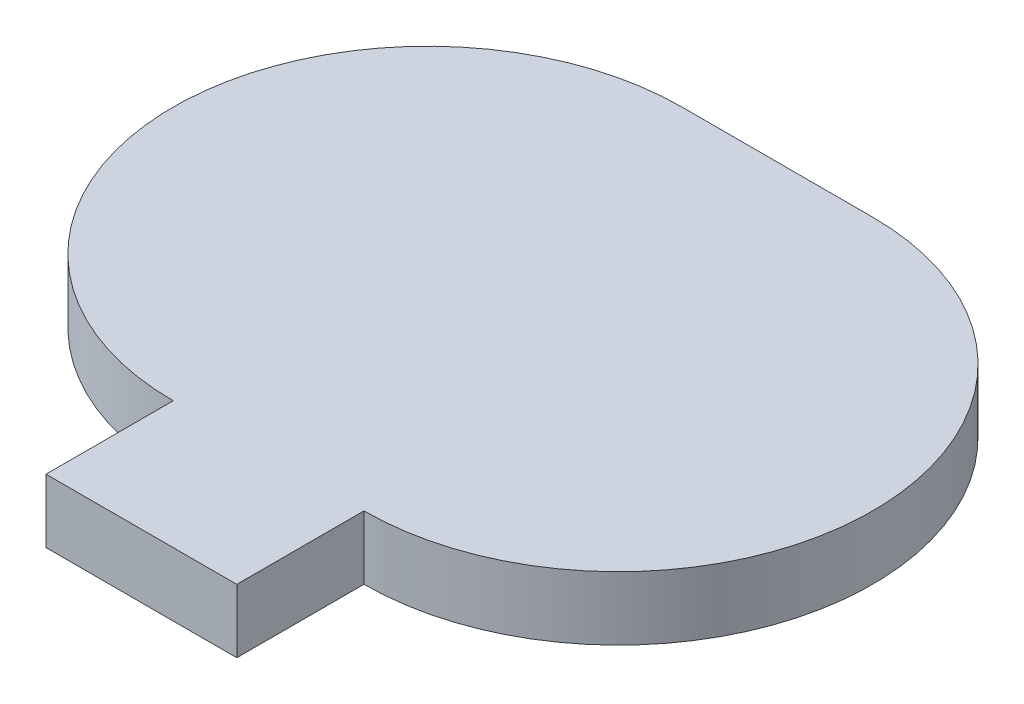
ISO-10303-21;
HEADER;
FILE_DESCRIPTION(('STEP AP214'),'2;1');
FILE_NAME('part.step','',(''),(''),'','','');
FILE_SCHEMA(('AUTOMOTIVE_DESIGN { 1 0 10303 214 1 1 1 1 }'));
ENDSEC;
DATA;
#1=APPLICATION_CONTEXT('core data for automotive mechanical design processes');
#2=APPLICATION_PROTOCOL_DEFINITION('international standard','automotive_design',2000,#1);
#3=PRODUCT_CONTEXT('',#1,'mechanical');
#4=PRODUCT('Part','Part','',(#3));
#5=PRODUCT_RELATED_PRODUCT_CATEGORY('part','',(#4));
#6=PRODUCT_DEFINITION_FORMATION('','',#4);
#7=PRODUCT_DEFINITION_CONTEXT('part definition',#1,'design');
#8=PRODUCT_DEFINITION('design','',#6,#7);
#9=PRODUCT_DEFINITION_SHAPE('','',#8);
#10=(LENGTH_UNIT() NAMED_UNIT(*) SI_UNIT(.MILLI.,.METRE.));
#11=(NAMED_UNIT(*) PLANE_ANGLE_UNIT() SI_UNIT($,.RADIAN.));
#12=(NAMED_UNIT(*) SI_UNIT($,.STERADIAN.) SOLID_ANGLE_UNIT());
#13=UNCERTAINTY_MEASURE_WITH_UNIT(LENGTH_MEASURE(1.E-05),#10,'distance_accuracy_value','');
#14=(GEOMETRIC_REPRESENTATION_CONTEXT(3) GLOBAL_UNCERTAINTY_ASSIGNED_CONTEXT((#13)) GLOBAL_UNIT_ASSIGNED_CONTEXT((#10,
#11,#12)) REPRESENTATION_CONTEXT('',''));
#15=CARTESIAN_POINT('',(0.,0.,0.));
#16=DIRECTION('',(0.,0.,1.));
#17=DIRECTION('',(1.,0.,0.));
#18=AXIS2_PLACEMENT_3D('',#15,#16,#17);
#19=CARTESIAN_POINT('',(-3.,2.,0.));
#20=DIRECTION('',(0.,0.,-1.));
#21=DIRECTION('',(-1.,0.,0.));
#22=AXIS2_PLACEMENT_3D('',#19,#20,#21);
#23=PLANE('',#22);
#24=DIRECTION('',(1.,0.,0.));
#25=VECTOR('',#24,1.);
#26=CARTESIAN_POINT('',(-3.,0.,0.));
#27=LINE('',#26,#25);
#28=CARTESIAN_POINT('',(-3.,0.,0.));
#29=VERTEX_POINT('',#28);
#30=CARTESIAN_POINT('',(3.,0.,0.));
#31=VERTEX_POINT('',#30);
#32=EDGE_CURVE('E117',#29,#31,#27,.T.);
#33=ORIENTED_EDGE('',*,*,#32,.T.);
#34=DIRECTION('',(0.,-1.,0.));
#35=VECTOR('',#34,1.);
#36=CARTESIAN_POINT('',(3.,2.,0.));
#37=LINE('',#36,#35);
#38=CARTESIAN_POINT('',(3.,2.,0.));
#39=VERTEX_POINT('',#38);
#40=EDGE_CURVE('E11',#39,#31,#37,.T.);
#41=ORIENTED_EDGE('',*,*,#40,.F.);
#42=DIRECTION('',(1.,0.,0.));
#43=VECTOR('',#42,1.);
#44=CARTESIAN_POINT('',(-3.,2.,0.));
#45=LINE('',#44,#43);
#46=CARTESIAN_POINT('',(-3.,2.,0.));
#47=VERTEX_POINT('',#46);
#48=EDGE_CURVE('E127',#47,#39,#45,.T.);
#49=ORIENTED_EDGE('',*,*,#48,.F.);
#50=DIRECTION('',(0.,-1.,0.));
#51=VECTOR('',#50,1.);
#52=CARTESIAN_POINT('',(-3.,2.,0.));
#53=LINE('',#52,#51);
#54=EDGE_CURVE('E113',#47,#29,#53,.T.);
#55=ORIENTED_EDGE('',*,*,#54,.T.);
#56=EDGE_LOOP('',(#33,#41,#49,#55));
#57=FACE_BOUND('',#56,.T.);
#58=ADVANCED_FACE('F33',(#57),#23,.F.);
#59=CARTESIAN_POINT('',(3.,2.,0.));
#60=DIRECTION('',(-1.,0.,0.));
#61=DIRECTION('',(0.,0.,1.));
#62=AXIS2_PLACEMENT_3D('',#59,#60,#61);
#63=PLANE('',#62);
#64=DIRECTION('',(0.,0.,-1.));
#65=VECTOR('',#64,1.);
#66=CARTESIAN_POINT('',(3.,0.,0.));
#67=LINE('',#66,#65);
#68=CARTESIAN_POINT('',(3.,0.,-4.));
#69=VERTEX_POINT('',#68);
#70=EDGE_CURVE('E120',#31,#69,#67,.T.);
#71=ORIENTED_EDGE('',*,*,#70,.T.);
#72=DIRECTION('',(0.,-1.,0.));
#73=VECTOR('',#72,1.);
#74=CARTESIAN_POINT('',(3.,2.,-4.));
#75=LINE('',#74,#73);
#76=CARTESIAN_POINT('',(3.,2.,-4.));
#77=VERTEX_POINT('',#76);
#78=EDGE_CURVE('E41',#77,#69,#75,.T.);
#79=ORIENTED_EDGE('',*,*,#78,.F.);
#80=DIRECTION('',(0.,0.,-1.));
#81=VECTOR('',#80,1.);
#82=CARTESIAN_POINT('',(3.,2.,0.));
#83=LINE('',#82,#81);
#84=EDGE_CURVE('E86',#39,#77,#83,.T.);
#85=ORIENTED_EDGE('',*,*,#84,.F.);
#86=ORIENTED_EDGE('',*,*,#40,.T.);
#87=EDGE_LOOP('',(#71,#79,#85,#86));
#88=FACE_BOUND('',#87,.T.);
#89=ADVANCED_FACE('F151',(#88),#63,.F.);
#90=CARTESIAN_POINT('',(3.,2.,-12.));
#91=DIRECTION('',(0.,-1.,0.));
#92=DIRECTION('',(0.,0.,-1.));
#93=AXIS2_PLACEMENT_3D('',#90,#91,#92);
#94=CYLINDRICAL_SURFACE('',#93,8.);
#95=CARTESIAN_POINT('',(3.,0.,-12.));
#96=DIRECTION('',(0.,1.,0.));
#97=DIRECTION('',(0.,0.,-1.));
#98=AXIS2_PLACEMENT_3D('',#95,#96,#97);
#99=CIRCLE('',#98,8.);
#100=CARTESIAN_POINT('',(3.,0.,-20.));
#101=VERTEX_POINT('',#100);
#102=EDGE_CURVE('E122',#69,#101,#99,.T.);
#103=ORIENTED_EDGE('',*,*,#102,.T.);
#104=DIRECTION('',(0.,-1.,0.));
#105=VECTOR('',#104,1.);
#106=CARTESIAN_POINT('',(3.,2.,-20.));
#107=LINE('',#106,#105);
#108=CARTESIAN_POINT('',(3.,2.,-20.));
#109=VERTEX_POINT('',#108);
#110=EDGE_CURVE('E108',#109,#101,#107,.T.);
#111=ORIENTED_EDGE('',*,*,#110,.F.);
#112=CARTESIAN_POINT('',(3.,2.,-12.));
#113=DIRECTION('',(0.,1.,0.));
#114=DIRECTION('',(0.,0.,-1.));
#115=AXIS2_PLACEMENT_3D('',#112,#113,#114);
#116=CIRCLE('',#115,8.);
#117=EDGE_CURVE('E99',#77,#109,#116,.T.);
#118=ORIENTED_EDGE('',*,*,#117,.F.);
#119=ORIENTED_EDGE('',*,*,#78,.T.);
#120=EDGE_LOOP('',(#103,#111,#118,#119));
#121=FACE_BOUND('',#120,.T.);
#122=ADVANCED_FACE('F133',(#121),#94,.T.);
#123=CARTESIAN_POINT('',(-3.,2.,-20.));
#124=DIRECTION('',(0.,0.,1.));
#125=DIRECTION('',(1.,0.,0.));
#126=AXIS2_PLACEMENT_3D('',#123,#124,#125);
#127=PLANE('',#126);
#128=DIRECTION('',(-1.,0.,0.));
#129=VECTOR('',#128,1.);
#130=CARTESIAN_POINT('',(-3.,0.,-20.));
#131=LINE('',#130,#129);
#132=CARTESIAN_POINT('',(-3.,0.,-20.));
#133=VERTEX_POINT('',#132);
#134=EDGE_CURVE('E107',#101,#133,#131,.T.);
#135=ORIENTED_EDGE('',*,*,#134,.T.);
#136=DIRECTION('',(0.,-1.,0.));
#137=VECTOR('',#136,1.);
#138=CARTESIAN_POINT('',(-3.,2.,-20.));
#139=LINE('',#138,#137);
#140=CARTESIAN_POINT('',(-3.,2.,-20.));
#141=VERTEX_POINT('',#140);
#142=EDGE_CURVE('E104',#141,#133,#139,.T.);
#143=ORIENTED_EDGE('',*,*,#142,.F.);
#144=DIRECTION('',(-1.,0.,0.));
#145=VECTOR('',#144,1.);
#146=CARTESIAN_POINT('',(-3.,2.,-20.));
#147=LINE('',#146,#145);
#148=EDGE_CURVE('E93',#109,#141,#147,.T.);
#149=ORIENTED_EDGE('',*,*,#148,.F.);
#150=ORIENTED_EDGE('',*,*,#110,.T.);
#151=EDGE_LOOP('',(#135,#143,#149,#150));
#152=FACE_BOUND('',#151,.T.);
#153=ADVANCED_FACE('F105',(#152),#127,.F.);
#154=CARTESIAN_POINT('',(-3.,2.,-12.));
#155=DIRECTION('',(0.,-1.,0.));
#156=DIRECTION('',(0.,0.,-1.));
#157=AXIS2_PLACEMENT_3D('',#154,#155,#156);
#158=CYLINDRICAL_SURFACE('',#157,8.);
#159=CARTESIAN_POINT('',(-3.,0.,-12.));
#160=DIRECTION('',(0.,1.,0.));
#161=DIRECTION('',(0.,0.,1.));
#162=AXIS2_PLACEMENT_3D('',#159,#160,#161);
#163=CIRCLE('',#162,8.);
#164=CARTESIAN_POINT('',(-3.,0.,-4.));
#165=VERTEX_POINT('',#164);
#166=EDGE_CURVE('E72',#133,#165,#163,.T.);
#167=ORIENTED_EDGE('',*,*,#166,.T.);
#168=DIRECTION('',(0.,-1.,0.));
#169=VECTOR('',#168,1.);
#170=CARTESIAN_POINT('',(-3.,2.,-4.));
#171=LINE('',#170,#169);
#172=CARTESIAN_POINT('',(-3.,2.,-4.));
#173=VERTEX_POINT('',#172);
#174=EDGE_CURVE('E109',#173,#165,#171,.T.);
#175=ORIENTED_EDGE('',*,*,#174,.F.);
#176=CARTESIAN_POINT('',(-3.,2.,-12.));
#177=DIRECTION('',(0.,1.,0.));
#178=DIRECTION('',(0.,0.,1.));
#179=AXIS2_PLACEMENT_3D('',#176,#177,#178);
#180=CIRCLE('',#179,8.);
#181=EDGE_CURVE('E97',#141,#173,#180,.T.);
#182=ORIENTED_EDGE('',*,*,#181,.F.);
#183=ORIENTED_EDGE('',*,*,#142,.T.);
#184=EDGE_LOOP('',(#167,#175,#182,#183));
#185=FACE_BOUND('',#184,.T.);
#186=ADVANCED_FACE('F111',(#185),#158,.T.);
#187=CARTESIAN_POINT('',(-3.,2.,-4.));
#188=DIRECTION('',(1.,0.,0.));
#189=DIRECTION('',(0.,0.,-1.));
#190=AXIS2_PLACEMENT_3D('',#187,#188,#189);
#191=PLANE('',#190);
#192=DIRECTION('',(0.,0.,1.));
#193=VECTOR('',#192,1.);
#194=CARTESIAN_POINT('',(-3.,0.,-4.));
#195=LINE('',#194,#193);
#196=EDGE_CURVE('E78',#165,#29,#195,.T.);
#197=ORIENTED_EDGE('',*,*,#196,.T.);
#198=ORIENTED_EDGE('',*,*,#54,.F.);
#199=DIRECTION('',(0.,0.,1.));
#200=VECTOR('',#199,1.);
#201=CARTESIAN_POINT('',(-3.,2.,-4.));
#202=LINE('',#201,#200);
#203=EDGE_CURVE('E49',#173,#47,#202,.T.);
#204=ORIENTED_EDGE('',*,*,#203,.F.);
#205=ORIENTED_EDGE('',*,*,#174,.T.);
#206=EDGE_LOOP('',(#197,#198,#204,#205));
#207=FACE_BOUND('',#206,.T.);
#208=ADVANCED_FACE('F140',(#207),#191,.F.);
#209=CARTESIAN_POINT('',(3.,2.,-12.));
#210=DIRECTION('',(0.,-1.,0.));
#211=DIRECTION('',(0.,0.,-1.));
#212=AXIS2_PLACEMENT_3D('',#209,#210,#211);
#213=PLANE('',#212);
#214=ORIENTED_EDGE('',*,*,#48,.T.);
#215=ORIENTED_EDGE('',*,*,#84,.T.);
#216=ORIENTED_EDGE('',*,*,#117,.T.);
#217=ORIENTED_EDGE('',*,*,#148,.T.);
#218=ORIENTED_EDGE('',*,*,#181,.T.);
#219=ORIENTED_EDGE('',*,*,#203,.T.);
#220=EDGE_LOOP('',(#214,#215,#216,#217,#218,#219));
#221=FACE_BOUND('',#220,.T.);
#222=ADVANCED_FACE('F95',(#221),#213,.F.);
#223=CARTESIAN_POINT('',(3.,0.,-12.));
#224=DIRECTION('',(0.,-1.,0.));
#225=DIRECTION('',(0.,0.,-1.));
#226=AXIS2_PLACEMENT_3D('',#223,#224,#225);
#227=PLANE('',#226);
#228=ORIENTED_EDGE('',*,*,#32,.F.);
#229=ORIENTED_EDGE('',*,*,#196,.F.);
#230=ORIENTED_EDGE('',*,*,#166,.F.);
#231=ORIENTED_EDGE('',*,*,#134,.F.);
#232=ORIENTED_EDGE('',*,*,#102,.F.);
#233=ORIENTED_EDGE('',*,*,#70,.F.);
#234=EDGE_LOOP('',(#228,#229,#230,#231,#232,#233));
#235=FACE_BOUND('',#234,.T.);
#236=ADVANCED_FACE('F136',(#235),#227,.T.);
#237=CLOSED_SHELL('',(#58,#89,#122,#153,#186,#208,#222,#236));
#238=MANIFOLD_SOLID_BREP('B2',#237);
#239=ADVANCED_BREP_SHAPE_REPRESENTATION('',(#18,#238),#14);
#240=SHAPE_DEFINITION_REPRESENTATION(#9,#239);
ENDSEC;
END-ISO-10303-21;
